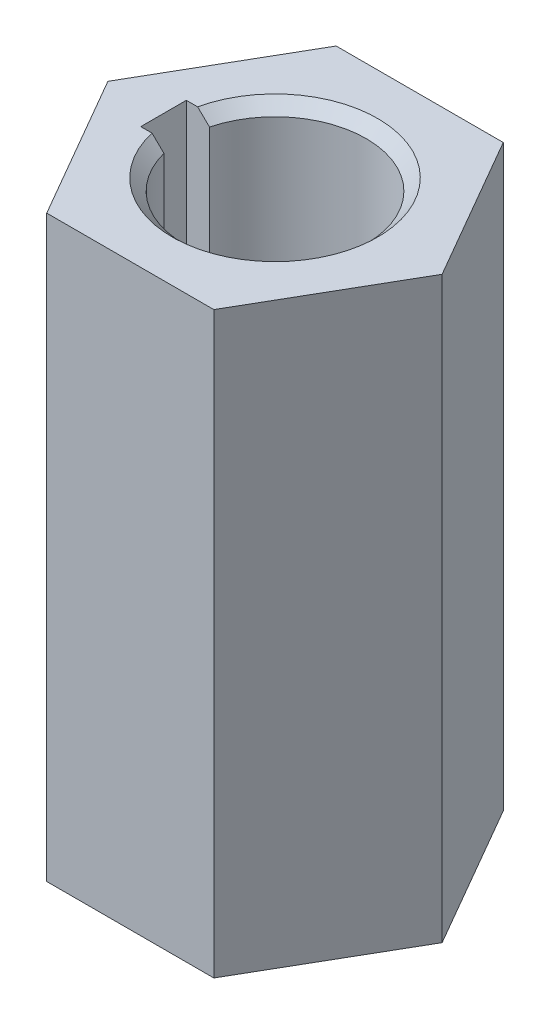
ISO-10303-21;
HEADER;
FILE_DESCRIPTION(('STEP AP214'),'2;1');
FILE_NAME('part.step','',(''),(''),'','','');
FILE_SCHEMA(('AUTOMOTIVE_DESIGN { 1 0 10303 214 1 1 1 1 }'));
ENDSEC;
DATA;
#1=APPLICATION_CONTEXT('core data for automotive mechanical design processes');
#2=APPLICATION_PROTOCOL_DEFINITION('international standard','automotive_design',2000,#1);
#3=PRODUCT_CONTEXT('',#1,'mechanical');
#4=PRODUCT('Part','Part','',(#3));
#5=PRODUCT_RELATED_PRODUCT_CATEGORY('part','',(#4));
#6=PRODUCT_DEFINITION_FORMATION('','',#4);
#7=PRODUCT_DEFINITION_CONTEXT('part definition',#1,'design');
#8=PRODUCT_DEFINITION('design','',#6,#7);
#9=PRODUCT_DEFINITION_SHAPE('','',#8);
#10=(LENGTH_UNIT() NAMED_UNIT(*) SI_UNIT(.MILLI.,.METRE.));
#11=(NAMED_UNIT(*) PLANE_ANGLE_UNIT() SI_UNIT($,.RADIAN.));
#12=(NAMED_UNIT(*) SI_UNIT($,.STERADIAN.) SOLID_ANGLE_UNIT());
#13=UNCERTAINTY_MEASURE_WITH_UNIT(LENGTH_MEASURE(1.E-05),#10,'distance_accuracy_value','');
#14=(GEOMETRIC_REPRESENTATION_CONTEXT(3) GLOBAL_UNCERTAINTY_ASSIGNED_CONTEXT((#13)) GLOBAL_UNIT_ASSIGNED_CONTEXT((#10,
#11,#12)) REPRESENTATION_CONTEXT('',''));
#15=CARTESIAN_POINT('',(0.,0.,0.));
#16=DIRECTION('',(0.,0.,1.));
#17=DIRECTION('',(1.,0.,0.));
#18=AXIS2_PLACEMENT_3D('',#15,#16,#17);
#19=CARTESIAN_POINT('',(-3.66617420935414,25.4,6.35000000000003));
#20=DIRECTION('',(0.,0.,-1.));
#21=DIRECTION('',(-1.,0.,0.));
#22=AXIS2_PLACEMENT_3D('',#19,#20,#21);
#23=PLANE('',#22);
#24=DIRECTION('',(0.,1.,0.));
#25=VECTOR('',#24,1.);
#26=CARTESIAN_POINT('',(3.66617420935414,25.4,6.35000000000002));
#27=LINE('',#26,#25);
#28=CARTESIAN_POINT('',(3.66617420935414,0.,6.35000000000003));
#29=VERTEX_POINT('',#28);
#30=CARTESIAN_POINT('',(3.66617420935414,25.4,6.35000000000003));
#31=VERTEX_POINT('',#30);
#32=EDGE_CURVE('E167',#29,#31,#27,.T.);
#33=ORIENTED_EDGE('',*,*,#32,.T.);
#34=DIRECTION('',(1.,0.,0.));
#35=VECTOR('',#34,1.);
#36=CARTESIAN_POINT('',(0.,25.4,6.35000000000003));
#37=LINE('',#36,#35);
#38=CARTESIAN_POINT('',(-3.66617420935414,25.4,6.35000000000003));
#39=VERTEX_POINT('',#38);
#40=EDGE_CURVE('E134',#39,#31,#37,.T.);
#41=ORIENTED_EDGE('',*,*,#40,.F.);
#42=DIRECTION('',(0.,1.,0.));
#43=VECTOR('',#42,1.);
#44=CARTESIAN_POINT('',(-3.66617420935414,25.4,6.35000000000003));
#45=LINE('',#44,#43);
#46=CARTESIAN_POINT('',(-3.66617420935414,0.,6.35000000000003));
#47=VERTEX_POINT('',#46);
#48=EDGE_CURVE('E151',#39,#47,#45,.F.);
#49=ORIENTED_EDGE('',*,*,#48,.T.);
#50=DIRECTION('',(1.,0.,0.));
#51=VECTOR('',#50,1.);
#52=CARTESIAN_POINT('',(0.,0.,6.35000000000003));
#53=LINE('',#52,#51);
#54=EDGE_CURVE('E174',#47,#29,#53,.T.);
#55=ORIENTED_EDGE('',*,*,#54,.T.);
#56=EDGE_LOOP('',(#33,#41,#49,#55));
#57=FACE_BOUND('',#56,.T.);
#58=ADVANCED_FACE('F20',(#57),#23,.F.);
#59=CARTESIAN_POINT('',(3.66617420935414,25.4,6.35000000000002));
#60=DIRECTION('',(-0.866025403784439,0.,-0.5));
#61=DIRECTION('',(-0.5,0.,0.866025403784439));
#62=AXIS2_PLACEMENT_3D('',#59,#60,#61);
#63=PLANE('',#62);
#64=DIRECTION('',(0.,1.,0.));
#65=VECTOR('',#64,1.);
#66=CARTESIAN_POINT('',(7.33234841870828,25.4,0.));
#67=LINE('',#66,#65);
#68=CARTESIAN_POINT('',(7.33234841870828,0.,0.));
#69=VERTEX_POINT('',#68);
#70=CARTESIAN_POINT('',(7.33234841870828,25.4,0.));
#71=VERTEX_POINT('',#70);
#72=EDGE_CURVE('E164',#69,#71,#67,.T.);
#73=ORIENTED_EDGE('',*,*,#72,.T.);
#74=DIRECTION('',(0.5,0.,-0.866025403784439));
#75=VECTOR('',#74,1.);
#76=CARTESIAN_POINT('',(3.66617420935414,25.4,6.35000000000002));
#77=LINE('',#76,#75);
#78=EDGE_CURVE('E138',#31,#71,#77,.T.);
#79=ORIENTED_EDGE('',*,*,#78,.F.);
#80=ORIENTED_EDGE('',*,*,#32,.F.);
#81=DIRECTION('',(0.5,0.,-0.866025403784439));
#82=VECTOR('',#81,1.);
#83=CARTESIAN_POINT('',(3.66617420935414,0.,6.35000000000002));
#84=LINE('',#83,#82);
#85=EDGE_CURVE('E154',#29,#69,#84,.T.);
#86=ORIENTED_EDGE('',*,*,#85,.T.);
#87=EDGE_LOOP('',(#73,#79,#80,#86));
#88=FACE_BOUND('',#87,.T.);
#89=ADVANCED_FACE('F227',(#88),#63,.F.);
#90=CARTESIAN_POINT('',(7.33234841870828,25.4,0.));
#91=DIRECTION('',(-0.866025403784439,0.,0.5));
#92=DIRECTION('',(0.5,0.,0.866025403784439));
#93=AXIS2_PLACEMENT_3D('',#90,#91,#92);
#94=PLANE('',#93);
#95=DIRECTION('',(0.,1.,0.));
#96=VECTOR('',#95,1.);
#97=CARTESIAN_POINT('',(3.66617420935414,25.4,-6.35000000000003));
#98=LINE('',#97,#96);
#99=CARTESIAN_POINT('',(3.66617420935414,0.,-6.35000000000003));
#100=VERTEX_POINT('',#99);
#101=CARTESIAN_POINT('',(3.66617420935414,25.4,-6.35000000000003));
#102=VERTEX_POINT('',#101);
#103=EDGE_CURVE('E161',#100,#102,#98,.T.);
#104=ORIENTED_EDGE('',*,*,#103,.T.);
#105=DIRECTION('',(-0.5,0.,-0.866025403784439));
#106=VECTOR('',#105,1.);
#107=CARTESIAN_POINT('',(7.33234841870828,25.4,0.));
#108=LINE('',#107,#106);
#109=EDGE_CURVE('E214',#71,#102,#108,.T.);
#110=ORIENTED_EDGE('',*,*,#109,.F.);
#111=ORIENTED_EDGE('',*,*,#72,.F.);
#112=DIRECTION('',(-0.5,0.,-0.866025403784439));
#113=VECTOR('',#112,1.);
#114=CARTESIAN_POINT('',(7.33234841870828,0.,0.));
#115=LINE('',#114,#113);
#116=EDGE_CURVE('E193',#69,#100,#115,.T.);
#117=ORIENTED_EDGE('',*,*,#116,.T.);
#118=EDGE_LOOP('',(#104,#110,#111,#117));
#119=FACE_BOUND('',#118,.T.);
#120=ADVANCED_FACE('F232',(#119),#94,.F.);
#121=CARTESIAN_POINT('',(3.66617420935414,25.4,-6.35000000000003));
#122=DIRECTION('',(0.,0.,1.));
#123=DIRECTION('',(1.,0.,0.));
#124=AXIS2_PLACEMENT_3D('',#121,#122,#123);
#125=PLANE('',#124);
#126=DIRECTION('',(0.,1.,0.));
#127=VECTOR('',#126,1.);
#128=CARTESIAN_POINT('',(-3.66617420935414,25.4,-6.35000000000002));
#129=LINE('',#128,#127);
#130=CARTESIAN_POINT('',(-3.66617420935414,0.,-6.35000000000003));
#131=VERTEX_POINT('',#130);
#132=CARTESIAN_POINT('',(-3.66617420935414,25.4,-6.35000000000003));
#133=VERTEX_POINT('',#132);
#134=EDGE_CURVE('E158',#131,#133,#129,.T.);
#135=ORIENTED_EDGE('',*,*,#134,.T.);
#136=DIRECTION('',(1.,0.,0.));
#137=VECTOR('',#136,1.);
#138=CARTESIAN_POINT('',(0.,25.4,-6.35000000000003));
#139=LINE('',#138,#137);
#140=EDGE_CURVE('E211',#102,#133,#139,.F.);
#141=ORIENTED_EDGE('',*,*,#140,.F.);
#142=ORIENTED_EDGE('',*,*,#103,.F.);
#143=DIRECTION('',(1.,0.,0.));
#144=VECTOR('',#143,1.);
#145=CARTESIAN_POINT('',(0.,0.,-6.35000000000003));
#146=LINE('',#145,#144);
#147=EDGE_CURVE('E190',#100,#131,#146,.F.);
#148=ORIENTED_EDGE('',*,*,#147,.T.);
#149=EDGE_LOOP('',(#135,#141,#142,#148));
#150=FACE_BOUND('',#149,.T.);
#151=ADVANCED_FACE('F240',(#150),#125,.F.);
#152=CARTESIAN_POINT('',(-3.66617420935414,25.4,-6.35000000000002));
#153=DIRECTION('',(0.866025403784439,0.,0.5));
#154=DIRECTION('',(0.5,0.,-0.866025403784439));
#155=AXIS2_PLACEMENT_3D('',#152,#153,#154);
#156=PLANE('',#155);
#157=DIRECTION('',(0.,1.,0.));
#158=VECTOR('',#157,1.);
#159=CARTESIAN_POINT('',(-7.33234841870828,25.4,0.));
#160=LINE('',#159,#158);
#161=CARTESIAN_POINT('',(-7.33234841870828,0.,0.));
#162=VERTEX_POINT('',#161);
#163=CARTESIAN_POINT('',(-7.33234841870828,25.4,0.));
#164=VERTEX_POINT('',#163);
#165=EDGE_CURVE('E155',#162,#164,#160,.T.);
#166=ORIENTED_EDGE('',*,*,#165,.T.);
#167=DIRECTION('',(-0.5,0.,0.866025403784439));
#168=VECTOR('',#167,1.);
#169=CARTESIAN_POINT('',(-3.66617420935414,25.4,-6.35000000000002));
#170=LINE('',#169,#168);
#171=EDGE_CURVE('E205',#133,#164,#170,.T.);
#172=ORIENTED_EDGE('',*,*,#171,.F.);
#173=ORIENTED_EDGE('',*,*,#134,.F.);
#174=DIRECTION('',(-0.5,0.,0.866025403784439));
#175=VECTOR('',#174,1.);
#176=CARTESIAN_POINT('',(-3.66617420935414,0.,-6.35000000000002));
#177=LINE('',#176,#175);
#178=EDGE_CURVE('E184',#131,#162,#177,.T.);
#179=ORIENTED_EDGE('',*,*,#178,.T.);
#180=EDGE_LOOP('',(#166,#172,#173,#179));
#181=FACE_BOUND('',#180,.T.);
#182=ADVANCED_FACE('F275',(#181),#156,.F.);
#183=CARTESIAN_POINT('',(-7.33234841870828,25.4,0.));
#184=DIRECTION('',(0.866025403784439,0.,-0.5));
#185=DIRECTION('',(-0.5,0.,-0.866025403784439));
#186=AXIS2_PLACEMENT_3D('',#183,#184,#185);
#187=PLANE('',#186);
#188=ORIENTED_EDGE('',*,*,#48,.F.);
#189=DIRECTION('',(0.5,0.,0.866025403784439));
#190=VECTOR('',#189,1.);
#191=CARTESIAN_POINT('',(-7.33234841870828,25.4,0.));
#192=LINE('',#191,#190);
#193=EDGE_CURVE('E202',#164,#39,#192,.T.);
#194=ORIENTED_EDGE('',*,*,#193,.F.);
#195=ORIENTED_EDGE('',*,*,#165,.F.);
#196=DIRECTION('',(0.5,0.,0.866025403784439));
#197=VECTOR('',#196,1.);
#198=CARTESIAN_POINT('',(-7.33234841870828,0.,0.));
#199=LINE('',#198,#197);
#200=EDGE_CURVE('E178',#162,#47,#199,.T.);
#201=ORIENTED_EDGE('',*,*,#200,.T.);
#202=EDGE_LOOP('',(#188,#194,#195,#201));
#203=FACE_BOUND('',#202,.T.);
#204=ADVANCED_FACE('F269',(#203),#187,.F.);
#205=CARTESIAN_POINT('',(-4.89,25.4,-1.));
#206=DIRECTION('',(1.,0.,0.));
#207=DIRECTION('',(0.,0.,-1.));
#208=AXIS2_PLACEMENT_3D('',#205,#206,#207);
#209=PLANE('',#208);
#210=DIRECTION('',(0.,0.,1.));
#211=VECTOR('',#210,1.);
#212=CARTESIAN_POINT('',(-4.89,25.4,0.));
#213=LINE('',#212,#211);
#214=CARTESIAN_POINT('',(-4.89,25.4,0.999999999999999));
#215=VERTEX_POINT('',#214);
#216=CARTESIAN_POINT('',(-4.89,25.4,-1.));
#217=VERTEX_POINT('',#216);
#218=EDGE_CURVE('E201',#215,#217,#213,.F.);
#219=ORIENTED_EDGE('',*,*,#218,.F.);
#220=DIRECTION('',(0.,1.,0.));
#221=VECTOR('',#220,1.);
#222=CARTESIAN_POINT('',(-4.89,25.4,0.999999999999999));
#223=LINE('',#222,#221);
#224=CARTESIAN_POINT('',(-4.89,0.,0.999999999999999));
#225=VERTEX_POINT('',#224);
#226=EDGE_CURVE('E91',#225,#215,#223,.T.);
#227=ORIENTED_EDGE('',*,*,#226,.F.);
#228=DIRECTION('',(0.,0.,1.));
#229=VECTOR('',#228,1.);
#230=CARTESIAN_POINT('',(-4.89,0.,0.));
#231=LINE('',#230,#229);
#232=CARTESIAN_POINT('',(-4.89,0.,-1.));
#233=VERTEX_POINT('',#232);
#234=EDGE_CURVE('E149',#225,#233,#231,.F.);
#235=ORIENTED_EDGE('',*,*,#234,.T.);
#236=DIRECTION('',(0.,1.,0.));
#237=VECTOR('',#236,1.);
#238=CARTESIAN_POINT('',(-4.89,25.4,-1.));
#239=LINE('',#238,#237);
#240=EDGE_CURVE('E135',#217,#233,#239,.F.);
#241=ORIENTED_EDGE('',*,*,#240,.F.);
#242=EDGE_LOOP('',(#219,#227,#235,#241));
#243=FACE_BOUND('',#242,.T.);
#244=ADVANCED_FACE('F267',(#243),#209,.T.);
#245=CARTESIAN_POINT('',(0.,0.,0.));
#246=DIRECTION('',(0.,1.,0.));
#247=DIRECTION('',(0.,0.,1.));
#248=AXIS2_PLACEMENT_3D('',#245,#246,#247);
#249=PLANE('',#248);
#250=DIRECTION('',(-1.,0.,0.));
#251=VECTOR('',#250,1.);
#252=CARTESIAN_POINT('',(-3.87298334620742,0.,1.));
#253=LINE('',#252,#251);
#254=CARTESIAN_POINT('',(-4.39568697704235,-2.8421709430404E-11,0.999999999999999));
#255=VERTEX_POINT('',#254);
#256=EDGE_CURVE('E199',#255,#225,#253,.T.);
#257=ORIENTED_EDGE('',*,*,#256,.F.);
#258=CARTESIAN_POINT('',(0.,-5.6843418860808E-11,0.));
#259=DIRECTION('',(0.,-1.,0.));
#260=DIRECTION('',(0.,0.,-1.));
#261=AXIS2_PLACEMENT_3D('',#258,#259,#260);
#262=CIRCLE('',#261,4.50800000004392);
#263=CARTESIAN_POINT('',(-4.39568697704235,-2.8421709430404E-11,-1.));
#264=VERTEX_POINT('',#263);
#265=EDGE_CURVE('E96',#255,#264,#262,.F.);
#266=ORIENTED_EDGE('',*,*,#265,.T.);
#267=DIRECTION('',(1.,0.,0.));
#268=VECTOR('',#267,1.);
#269=CARTESIAN_POINT('',(-4.89,0.,-1.));
#270=LINE('',#269,#268);
#271=EDGE_CURVE('E146',#233,#264,#270,.T.);
#272=ORIENTED_EDGE('',*,*,#271,.F.);
#273=ORIENTED_EDGE('',*,*,#234,.F.);
#274=EDGE_LOOP('',(#257,#266,#272,#273));
#275=FACE_BOUND('',#274,.T.);
#276=ORIENTED_EDGE('',*,*,#200,.F.);
#277=ORIENTED_EDGE('',*,*,#178,.F.);
#278=ORIENTED_EDGE('',*,*,#147,.F.);
#279=ORIENTED_EDGE('',*,*,#116,.F.);
#280=ORIENTED_EDGE('',*,*,#85,.F.);
#281=ORIENTED_EDGE('',*,*,#54,.F.);
#282=EDGE_LOOP('',(#276,#277,#278,#279,#280,#281));
#283=FACE_BOUND('',#282,.T.);
#284=ADVANCED_FACE('F125',(#275,#283),#249,.F.);
#285=CARTESIAN_POINT('',(-4.89,25.4,-1.));
#286=DIRECTION('',(0.,0.,1.));
#287=DIRECTION('',(1.,0.,0.));
#288=AXIS2_PLACEMENT_3D('',#285,#286,#287);
#289=PLANE('',#288);
#290=DIRECTION('',(1.,0.,0.));
#291=VECTOR('',#290,1.);
#292=CARTESIAN_POINT('',(0.,25.4,-1.));
#293=LINE('',#292,#291);
#294=CARTESIAN_POINT('',(-4.39568697701806,25.3999999999953,-1.));
#295=VERTEX_POINT('',#294);
#296=EDGE_CURVE('E75',#217,#295,#293,.T.);
#297=ORIENTED_EDGE('',*,*,#296,.F.);
#298=ORIENTED_EDGE('',*,*,#240,.T.);
#299=ORIENTED_EDGE('',*,*,#271,.T.);
#300=CARTESIAN_POINT('',(-4.39568697703447,-2.0734738518323E-11,-1.));
#301=CARTESIAN_POINT('',(-4.30871808859412,0.0848193368557838,-1.));
#302=CARTESIAN_POINT('',(-4.22167501047096,0.169562336691803,-1.));
#303=CARTESIAN_POINT('',(-4.04744046687027,0.338895670046851,-1.));
#304=CARTESIAN_POINT('',(-3.96024900137914,0.423486003551879,-1.));
#305=CARTESIAN_POINT('',(-3.87298334619158,0.508000000002407,-1.));
#306=B_SPLINE_CURVE_WITH_KNOTS('',3,(#300,#301,#302,#303,#304,#305),.UNSPECIFIED.,.F.,.F.,(4,2,
4),(0.,0.364445964764688,0.728891962949396),.UNSPECIFIED.);
#307=CARTESIAN_POINT('',(-3.87298334619951,0.508000000001202,-1.));
#308=VERTEX_POINT('',#307);
#309=EDGE_CURVE('E23',#264,#308,#306,.T.);
#310=ORIENTED_EDGE('',*,*,#309,.T.);
#311=DIRECTION('',(0.,-1.,0.));
#312=VECTOR('',#311,1.);
#313=CARTESIAN_POINT('',(-3.87298334620742,25.4,-1.));
#314=LINE('',#313,#312);
#315=CARTESIAN_POINT('',(-3.87298334621211,24.8920000000063,-1.));
#316=VERTEX_POINT('',#315);
#317=EDGE_CURVE('E81',#308,#316,#314,.F.);
#318=ORIENTED_EDGE('',*,*,#317,.T.);
#319=CARTESIAN_POINT('',(-3.8729833462168,24.8920000000126,-1.));
#320=CARTESIAN_POINT('',(-3.96024900139739,24.9765139964564,-1.));
#321=CARTESIAN_POINT('',(-4.04744046688156,25.0611043299547,-1.));
#322=CARTESIAN_POINT('',(-4.22167501046836,25.2304376632962,-1.));
#323=CARTESIAN_POINT('',(-4.30871808858459,25.3151806631255,-1.));
#324=CARTESIAN_POINT('',(-4.39568697701801,25.3999999999952,-1.));
#325=B_SPLINE_CURVE_WITH_KNOTS('',3,(#319,#320,#321,#322,#323,#324),.UNSPECIFIED.,.F.,.F.,(4,2,
4),(0.,0.364445998155663,0.728891962891309),.UNSPECIFIED.);
#326=EDGE_CURVE('E129',#316,#295,#325,.T.);
#327=ORIENTED_EDGE('',*,*,#326,.T.);
#328=EDGE_LOOP('',(#297,#298,#299,#310,#318,#327));
#329=FACE_BOUND('',#328,.T.);
#330=ADVANCED_FACE('F121',(#329),#289,.T.);
#331=CARTESIAN_POINT('',(0.,25.4,0.));
#332=DIRECTION('',(0.,1.,0.));
#333=DIRECTION('',(0.,0.,1.));
#334=AXIS2_PLACEMENT_3D('',#331,#332,#333);
#335=PLANE('',#334);
#336=DIRECTION('',(-1.,0.,0.));
#337=VECTOR('',#336,1.);
#338=CARTESIAN_POINT('',(-3.87298334620742,25.4,1.));
#339=LINE('',#338,#337);
#340=CARTESIAN_POINT('',(-4.39568697701805,25.3999999999953,0.999999999999999));
#341=VERTEX_POINT('',#340);
#342=EDGE_CURVE('E73',#215,#341,#339,.F.);
#343=ORIENTED_EDGE('',*,*,#342,.F.);
#344=ORIENTED_EDGE('',*,*,#218,.T.);
#345=ORIENTED_EDGE('',*,*,#296,.T.);
#346=CARTESIAN_POINT('',(0.,25.3999999999905,0.));
#347=DIRECTION('',(0.,1.,0.));
#348=DIRECTION('',(0.,0.,1.));
#349=AXIS2_PLACEMENT_3D('',#346,#347,#348);
#350=CIRCLE('',#349,4.50799999998708);
#351=EDGE_CURVE('E68',#295,#341,#350,.F.);
#352=ORIENTED_EDGE('',*,*,#351,.T.);
#353=EDGE_LOOP('',(#343,#344,#345,#352));
#354=FACE_BOUND('',#353,.T.);
#355=ORIENTED_EDGE('',*,*,#171,.T.);
#356=ORIENTED_EDGE('',*,*,#193,.T.);
#357=ORIENTED_EDGE('',*,*,#40,.T.);
#358=ORIENTED_EDGE('',*,*,#78,.T.);
#359=ORIENTED_EDGE('',*,*,#109,.T.);
#360=ORIENTED_EDGE('',*,*,#140,.T.);
#361=EDGE_LOOP('',(#355,#356,#357,#358,#359,#360));
#362=FACE_BOUND('',#361,.T.);
#363=ADVANCED_FACE('F70',(#354,#362),#335,.T.);
#364=CARTESIAN_POINT('',(-3.87298334620742,25.4,1.));
#365=DIRECTION('',(0.,0.,-1.));
#366=DIRECTION('',(-1.,0.,0.));
#367=AXIS2_PLACEMENT_3D('',#364,#365,#366);
#368=PLANE('',#367);
#369=ORIENTED_EDGE('',*,*,#342,.T.);
#370=CARTESIAN_POINT('',(-4.39568697701737,25.3999999999946,0.999999999999999));
#371=CARTESIAN_POINT('',(-4.30871808858405,25.315180663125,0.999999999999999));
#372=CARTESIAN_POINT('',(-4.22167501046793,25.2304376632958,0.999999999999999));
#373=CARTESIAN_POINT('',(-4.04744046688135,25.0611043299544,0.999999999999999));
#374=CARTESIAN_POINT('',(-3.96024900139728,24.9765139964563,0.999999999999999));
#375=CARTESIAN_POINT('',(-3.8729833462168,24.8920000000126,1.));
#376=B_SPLINE_CURVE_WITH_KNOTS('',3,(#370,#371,#372,#373,#374,#375),.UNSPECIFIED.,.F.,.F.,(4,2,
4),(0.,0.364445964735194,0.728891962890405),.UNSPECIFIED.);
#377=CARTESIAN_POINT('',(-3.87298334621211,24.8920000000063,1.));
#378=VERTEX_POINT('',#377);
#379=EDGE_CURVE('E88',#341,#378,#376,.T.);
#380=ORIENTED_EDGE('',*,*,#379,.T.);
#381=DIRECTION('',(0.,-1.,0.));
#382=VECTOR('',#381,1.);
#383=CARTESIAN_POINT('',(-3.87298334620742,25.4,1.));
#384=LINE('',#383,#382);
#385=CARTESIAN_POINT('',(-3.87298334619598,0.508000000004612,1.));
#386=VERTEX_POINT('',#385);
#387=EDGE_CURVE('E80',#378,#386,#384,.T.);
#388=ORIENTED_EDGE('',*,*,#387,.T.);
#389=CARTESIAN_POINT('',(-3.87298334618455,0.508000000009219,1.));
#390=CARTESIAN_POINT('',(-3.96024900137401,0.42348600355685,0.999999999999999));
#391=CARTESIAN_POINT('',(-4.04744046686705,0.338895670049977,0.999999999999999));
#392=CARTESIAN_POINT('',(-4.22167501047155,0.169562336691234,0.999999999999999));
#393=CARTESIAN_POINT('',(-4.30871808859661,0.0848193368533642,0.999999999999999));
#394=CARTESIAN_POINT('',(-4.39568697703885,-2.50090035507022E-11,0.999999999999999));
#395=B_SPLINE_CURVE_WITH_KNOTS('',3,(#389,#390,#391,#392,#393,#394),.UNSPECIFIED.,.F.,.F.,(4,2,
4),(0.,0.364445998192665,0.72889196296531),.UNSPECIFIED.);
#396=EDGE_CURVE('E93',#386,#255,#395,.T.);
#397=ORIENTED_EDGE('',*,*,#396,.T.);
#398=ORIENTED_EDGE('',*,*,#256,.T.);
#399=ORIENTED_EDGE('',*,*,#226,.T.);
#400=EDGE_LOOP('',(#369,#380,#388,#397,#398,#399));
#401=FACE_BOUND('',#400,.T.);
#402=ADVANCED_FACE('F86',(#401),#368,.T.);
#403=CARTESIAN_POINT('',(0.,5.6843418860808E-11,0.));
#404=DIRECTION('',(0.,-1.,0.));
#405=DIRECTION('',(0.,0.,-1.));
#406=AXIS2_PLACEMENT_3D('',#403,#404,#405);
#407=CONICAL_SURFACE('',#406,4.50799999993023,0.785398163397448);
#408=CARTESIAN_POINT('',(0.,0.508000000000005,0.));
#409=DIRECTION('',(0.,-1.,0.));
#410=DIRECTION('',(0.,0.,-1.));
#411=AXIS2_PLACEMENT_3D('',#408,#409,#410);
#412=CIRCLE('',#411,4.);
#413=EDGE_CURVE('E35',#386,#308,#412,.F.);
#414=ORIENTED_EDGE('',*,*,#413,.T.);
#415=ORIENTED_EDGE('',*,*,#309,.F.);
#416=ORIENTED_EDGE('',*,*,#265,.F.);
#417=ORIENTED_EDGE('',*,*,#396,.F.);
#418=EDGE_LOOP('',(#414,#415,#416,#417));
#419=FACE_BOUND('',#418,.T.);
#420=ADVANCED_FACE('F117',(#419),#407,.F.);
#421=CARTESIAN_POINT('',(0.,25.3999999999905,0.));
#422=DIRECTION('',(0.,1.,0.));
#423=DIRECTION('',(0.,0.,1.));
#424=AXIS2_PLACEMENT_3D('',#421,#422,#423);
#425=CONICAL_SURFACE('',#424,4.50799999998708,0.785398163397448);
#426=CARTESIAN_POINT('',(0.,24.892,0.));
#427=DIRECTION('',(0.,-1.,0.));
#428=DIRECTION('',(0.,0.,-1.));
#429=AXIS2_PLACEMENT_3D('',#426,#427,#428);
#430=CIRCLE('',#429,4.);
#431=EDGE_CURVE('E12',#316,#378,#430,.T.);
#432=ORIENTED_EDGE('',*,*,#431,.T.);
#433=ORIENTED_EDGE('',*,*,#379,.F.);
#434=ORIENTED_EDGE('',*,*,#351,.F.);
#435=ORIENTED_EDGE('',*,*,#326,.F.);
#436=EDGE_LOOP('',(#432,#433,#434,#435));
#437=FACE_BOUND('',#436,.T.);
#438=ADVANCED_FACE('F95',(#437),#425,.F.);
#439=CARTESIAN_POINT('',(0.,25.4,0.));
#440=DIRECTION('',(0.,-1.,0.));
#441=DIRECTION('',(0.,0.,-1.));
#442=AXIS2_PLACEMENT_3D('',#439,#440,#441);
#443=CYLINDRICAL_SURFACE('',#442,4.);
#444=ORIENTED_EDGE('',*,*,#431,.F.);
#445=ORIENTED_EDGE('',*,*,#317,.F.);
#446=ORIENTED_EDGE('',*,*,#413,.F.);
#447=ORIENTED_EDGE('',*,*,#387,.F.);
#448=EDGE_LOOP('',(#444,#445,#446,#447));
#449=FACE_BOUND('',#448,.T.);
#450=ADVANCED_FACE('F278',(#449),#443,.F.);
#451=CLOSED_SHELL('',(#58,#89,#120,#151,#182,#204,#244,#284,#330,#363,#402,#420,#438,#450));
#452=MANIFOLD_SOLID_BREP('B1',#451);
#453=ADVANCED_BREP_SHAPE_REPRESENTATION('',(#18,#452),#14);
#454=SHAPE_DEFINITION_REPRESENTATION(#9,#453);
ENDSEC;
END-ISO-10303-21;
